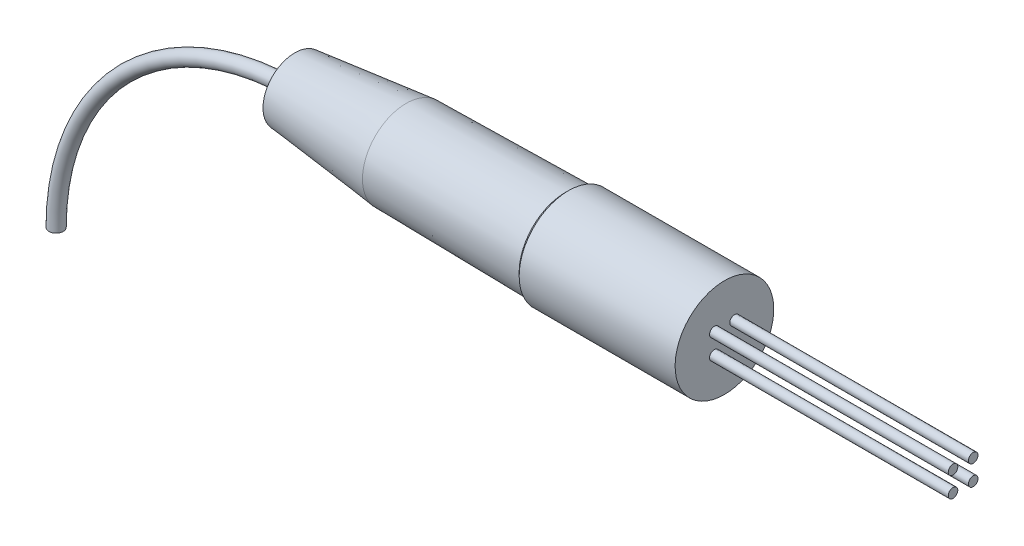
ISO-10303-21;
HEADER;
FILE_DESCRIPTION(('STEP AP214'),'2;1');
FILE_NAME('part.step','',(''),(''),'','','');
FILE_SCHEMA(('AUTOMOTIVE_DESIGN { 1 0 10303 214 1 1 1 1 }'));
ENDSEC;
DATA;
#1=APPLICATION_CONTEXT('core data for automotive mechanical design processes');
#2=APPLICATION_PROTOCOL_DEFINITION('international standard','automotive_design',2000,#1);
#3=PRODUCT_CONTEXT('',#1,'mechanical');
#4=PRODUCT('Part','Part','',(#3));
#5=PRODUCT_RELATED_PRODUCT_CATEGORY('part','',(#4));
#6=PRODUCT_DEFINITION_FORMATION('','',#4);
#7=PRODUCT_DEFINITION_CONTEXT('part definition',#1,'design');
#8=PRODUCT_DEFINITION('design','',#6,#7);
#9=PRODUCT_DEFINITION_SHAPE('','',#8);
#10=(LENGTH_UNIT() NAMED_UNIT(*) SI_UNIT(.MILLI.,.METRE.));
#11=(NAMED_UNIT(*) PLANE_ANGLE_UNIT() SI_UNIT($,.RADIAN.));
#12=(NAMED_UNIT(*) SI_UNIT($,.STERADIAN.) SOLID_ANGLE_UNIT());
#13=UNCERTAINTY_MEASURE_WITH_UNIT(LENGTH_MEASURE(1.E-05),#10,'distance_accuracy_value','');
#14=(GEOMETRIC_REPRESENTATION_CONTEXT(3) GLOBAL_UNCERTAINTY_ASSIGNED_CONTEXT((#13)) GLOBAL_UNIT_ASSIGNED_CONTEXT((#10,
#11,#12)) REPRESENTATION_CONTEXT('',''));
#15=CARTESIAN_POINT('',(0.,0.,0.));
#16=DIRECTION('',(0.,0.,1.));
#17=DIRECTION('',(1.,0.,0.));
#18=AXIS2_PLACEMENT_3D('',#15,#16,#17);
#19=CARTESIAN_POINT('',(0.,0.,0.));
#20=DIRECTION('',(-1.,0.,0.));
#21=DIRECTION('',(0.,-1.,0.));
#22=AXIS2_PLACEMENT_3D('',#19,#20,#21);
#23=PLANE('',#22);
#24=CARTESIAN_POINT('',(0.,0.635000000000003,-0.634999999999999));
#25=DIRECTION('',(-1.,0.,0.));
#26=DIRECTION('',(0.,-1.,0.));
#27=AXIS2_PLACEMENT_3D('',#24,#25,#26);
#28=CIRCLE('',#27,0.3);
#29=CARTESIAN_POINT('',(0.,0.335000000000003,-0.634999999999999));
#30=VERTEX_POINT('',#29);
#31=EDGE_CURVE('E36',#30,#30,#28,.F.);
#32=ORIENTED_EDGE('',*,*,#31,.F.);
#33=EDGE_LOOP('',(#32));
#34=FACE_BOUND('',#33,.T.);
#35=CARTESIAN_POINT('',(0.,0.635,0.634999999999999));
#36=DIRECTION('',(-1.,0.,0.));
#37=DIRECTION('',(0.,-1.,0.));
#38=AXIS2_PLACEMENT_3D('',#35,#36,#37);
#39=CIRCLE('',#38,0.3);
#40=CARTESIAN_POINT('',(0.,0.335,0.634999999999999));
#41=VERTEX_POINT('',#40);
#42=EDGE_CURVE('E44',#41,#41,#39,.F.);
#43=ORIENTED_EDGE('',*,*,#42,.F.);
#44=EDGE_LOOP('',(#43));
#45=FACE_BOUND('',#44,.T.);
#46=CARTESIAN_POINT('',(0.,0.,0.));
#47=DIRECTION('',(-1.,0.,0.));
#48=DIRECTION('',(0.,-1.,0.));
#49=AXIS2_PLACEMENT_3D('',#46,#47,#48);
#50=CIRCLE('',#49,3.1);
#51=CARTESIAN_POINT('',(0.,-3.1,0.));
#52=VERTEX_POINT('',#51);
#53=EDGE_CURVE('E62',#52,#52,#50,.T.);
#54=ORIENTED_EDGE('',*,*,#53,.F.);
#55=EDGE_LOOP('',(#54));
#56=FACE_BOUND('',#55,.T.);
#57=CARTESIAN_POINT('',(0.,-0.635,0.634999999999999));
#58=DIRECTION('',(-1.,0.,0.));
#59=DIRECTION('',(0.,-1.,0.));
#60=AXIS2_PLACEMENT_3D('',#57,#58,#59);
#61=CIRCLE('',#60,0.3);
#62=CARTESIAN_POINT('',(0.,-0.935,0.634999999999999));
#63=VERTEX_POINT('',#62);
#64=EDGE_CURVE('E40',#63,#63,#61,.F.);
#65=ORIENTED_EDGE('',*,*,#64,.F.);
#66=EDGE_LOOP('',(#65));
#67=FACE_BOUND('',#66,.T.);
#68=CARTESIAN_POINT('',(0.,-0.634999999999996,-0.634999999999999));
#69=DIRECTION('',(-1.,0.,0.));
#70=DIRECTION('',(0.,-1.,0.));
#71=AXIS2_PLACEMENT_3D('',#68,#69,#70);
#72=CIRCLE('',#71,0.3);
#73=CARTESIAN_POINT('',(0.,-0.934999999999996,-0.634999999999999));
#74=VERTEX_POINT('',#73);
#75=EDGE_CURVE('E10',#74,#74,#72,.F.);
#76=ORIENTED_EDGE('',*,*,#75,.F.);
#77=EDGE_LOOP('',(#76));
#78=FACE_BOUND('',#77,.T.);
#79=ADVANCED_FACE('F30',(#34,#45,#56,#67,#78),#23,.F.);
#80=CARTESIAN_POINT('',(-27.,1.99999999999999,0.));
#81=DIRECTION('',(1.,0.,0.));
#82=DIRECTION('',(0.,1.,0.));
#83=AXIS2_PLACEMENT_3D('',#80,#81,#82);
#84=PLANE('',#83);
#85=CARTESIAN_POINT('',(-27.,0.,0.));
#86=DIRECTION('',(-1.,0.,0.));
#87=DIRECTION('',(0.,-1.,0.));
#88=AXIS2_PLACEMENT_3D('',#85,#86,#87);
#89=CIRCLE('',#88,1.99999999999999);
#90=CARTESIAN_POINT('',(-27.,-1.99999999999999,0.));
#91=VERTEX_POINT('',#90);
#92=EDGE_CURVE('E53',#91,#91,#89,.T.);
#93=ORIENTED_EDGE('',*,*,#92,.T.);
#94=EDGE_LOOP('',(#93));
#95=FACE_BOUND('',#94,.T.);
#96=CARTESIAN_POINT('',(-27.,0.,0.));
#97=DIRECTION('',(-1.,0.,0.));
#98=DIRECTION('',(0.,-1.,0.));
#99=AXIS2_PLACEMENT_3D('',#96,#97,#98);
#100=CIRCLE('',#99,0.45);
#101=CARTESIAN_POINT('',(-27.,0.449999999999997,0.));
#102=VERTEX_POINT('',#101);
#103=EDGE_CURVE('E49',#102,#102,#100,.T.);
#104=ORIENTED_EDGE('',*,*,#103,.F.);
#105=EDGE_LOOP('',(#104));
#106=FACE_BOUND('',#105,.T.);
#107=ADVANCED_FACE('F98',(#95,#106),#84,.F.);
#108=CARTESIAN_POINT('',(-20.,0.,0.));
#109=DIRECTION('',(1.,0.,0.));
#110=DIRECTION('',(0.,1.,0.));
#111=AXIS2_PLACEMENT_3D('',#108,#109,#110);
#112=CONICAL_SURFACE('',#111,2.75,0.106735672649136);
#113=ORIENTED_EDGE('',*,*,#92,.F.);
#114=EDGE_LOOP('',(#113));
#115=FACE_BOUND('',#114,.T.);
#116=CARTESIAN_POINT('',(-20.,0.,0.));
#117=DIRECTION('',(-1.,0.,0.));
#118=DIRECTION('',(0.,-1.,0.));
#119=AXIS2_PLACEMENT_3D('',#116,#117,#118);
#120=CIRCLE('',#119,2.75);
#121=CARTESIAN_POINT('',(-20.,-2.75,0.));
#122=VERTEX_POINT('',#121);
#123=EDGE_CURVE('E56',#122,#122,#120,.T.);
#124=ORIENTED_EDGE('',*,*,#123,.T.);
#125=EDGE_LOOP('',(#124));
#126=FACE_BOUND('',#125,.T.);
#127=ADVANCED_FACE('F103',(#115,#126),#112,.T.);
#128=CARTESIAN_POINT('',(-10.,0.,0.));
#129=DIRECTION('',(1.,0.,0.));
#130=DIRECTION('',(0.,1.,0.));
#131=AXIS2_PLACEMENT_3D('',#128,#129,#130);
#132=CONICAL_SURFACE('',#131,2.9,0.0149988751518507);
#133=ORIENTED_EDGE('',*,*,#123,.F.);
#134=EDGE_LOOP('',(#133));
#135=FACE_BOUND('',#134,.T.);
#136=CARTESIAN_POINT('',(-10.,0.,0.));
#137=DIRECTION('',(-1.,0.,0.));
#138=DIRECTION('',(0.,-1.,0.));
#139=AXIS2_PLACEMENT_3D('',#136,#137,#138);
#140=CIRCLE('',#139,2.9);
#141=CARTESIAN_POINT('',(-10.,-2.9,0.));
#142=VERTEX_POINT('',#141);
#143=EDGE_CURVE('E59',#142,#142,#140,.T.);
#144=ORIENTED_EDGE('',*,*,#143,.T.);
#145=EDGE_LOOP('',(#144));
#146=FACE_BOUND('',#145,.T.);
#147=ADVANCED_FACE('F149',(#135,#146),#132,.T.);
#148=CARTESIAN_POINT('',(-27.,0.,0.));
#149=DIRECTION('',(-1.,0.,0.));
#150=DIRECTION('',(0.,-1.,0.));
#151=AXIS2_PLACEMENT_3D('',#148,#149,#150);
#152=CYLINDRICAL_SURFACE('',#151,3.1);
#153=CARTESIAN_POINT('',(-9.80000000000001,0.,0.));
#154=DIRECTION('',(1.,0.,0.));
#155=DIRECTION('',(0.,1.,0.));
#156=AXIS2_PLACEMENT_3D('',#153,#154,#155);
#157=CIRCLE('',#156,3.1);
#158=CARTESIAN_POINT('',(-9.80000000000001,3.1,0.));
#159=VERTEX_POINT('',#158);
#160=EDGE_CURVE('E50',#159,#159,#157,.T.);
#161=ORIENTED_EDGE('',*,*,#160,.T.);
#162=EDGE_LOOP('',(#161));
#163=FACE_BOUND('',#162,.T.);
#164=ORIENTED_EDGE('',*,*,#53,.T.);
#165=EDGE_LOOP('',(#164));
#166=FACE_BOUND('',#165,.T.);
#167=ADVANCED_FACE('F145',(#163,#166),#152,.T.);
#168=CARTESIAN_POINT('',(-10.,0.,0.));
#169=DIRECTION('',(1.,0.,0.));
#170=DIRECTION('',(0.,1.,0.));
#171=AXIS2_PLACEMENT_3D('',#168,#169,#170);
#172=CONICAL_SURFACE('',#171,2.9,0.785398163397456);
#173=ORIENTED_EDGE('',*,*,#160,.F.);
#174=EDGE_LOOP('',(#173));
#175=FACE_BOUND('',#174,.T.);
#176=ORIENTED_EDGE('',*,*,#143,.F.);
#177=EDGE_LOOP('',(#176));
#178=FACE_BOUND('',#177,.T.);
#179=ADVANCED_FACE('F139',(#175,#178),#172,.T.);
#180=CARTESIAN_POINT('',(-27.,-15.,0.));
#181=DIRECTION('',(0.,0.,-1.));
#182=DIRECTION('',(-1.,0.,0.));
#183=AXIS2_PLACEMENT_3D('',#180,#181,#182);
#184=TOROIDAL_SURFACE('',#183,15.,0.45);
#185=CARTESIAN_POINT('',(-42.,-15.,0.));
#186=DIRECTION('',(0.,-1.,0.));
#187=DIRECTION('',(1.,0.,0.));
#188=AXIS2_PLACEMENT_3D('',#185,#186,#187);
#189=CIRCLE('',#188,0.45);
#190=CARTESIAN_POINT('',(-42.45,-15.,0.));
#191=VERTEX_POINT('',#190);
#192=EDGE_CURVE('E65',#191,#191,#189,.T.);
#193=CARTESIAN_POINT('',(-27.,-15.,0.));
#194=DIRECTION('',(0.,0.,-1.));
#195=DIRECTION('',(-1.,0.,0.));
#196=AXIS2_PLACEMENT_3D('',#193,#194,#195);
#197=CIRCLE('',#196,15.45);
#198=EDGE_CURVE('',#191,#102,#197,.T.);
#199=ORIENTED_EDGE('',*,*,#192,.F.);
#200=ORIENTED_EDGE('',*,*,#103,.T.);
#201=ORIENTED_EDGE('',*,*,#198,.T.);
#202=ORIENTED_EDGE('',*,*,#198,.F.);
#203=EDGE_LOOP('',(#199,#201,#200,#202));
#204=FACE_BOUND('',#203,.T.);
#205=ADVANCED_FACE('F135',(#204),#184,.T.);
#206=CARTESIAN_POINT('',(-42.,-15.,0.));
#207=DIRECTION('',(0.,-1.,0.));
#208=DIRECTION('',(1.,0.,0.));
#209=AXIS2_PLACEMENT_3D('',#206,#207,#208);
#210=PLANE('',#209);
#211=ORIENTED_EDGE('',*,*,#192,.T.);
#212=EDGE_LOOP('',(#211));
#213=FACE_BOUND('',#212,.T.);
#214=ADVANCED_FACE('F133',(#213),#210,.T.);
#215=CARTESIAN_POINT('',(15.,0.635,0.634999999999999));
#216=DIRECTION('',(-1.,0.,0.));
#217=DIRECTION('',(0.,-1.,0.));
#218=AXIS2_PLACEMENT_3D('',#215,#216,#217);
#219=CYLINDRICAL_SURFACE('',#218,0.3);
#220=CARTESIAN_POINT('',(15.,0.635,0.634999999999999));
#221=DIRECTION('',(1.,0.,0.));
#222=DIRECTION('',(0.,1.,0.));
#223=AXIS2_PLACEMENT_3D('',#220,#221,#222);
#224=CIRCLE('',#223,0.3);
#225=CARTESIAN_POINT('',(15.,0.935,0.634999999999999));
#226=VERTEX_POINT('',#225);
#227=EDGE_CURVE('E68',#226,#226,#224,.T.);
#228=ORIENTED_EDGE('',*,*,#227,.F.);
#229=EDGE_LOOP('',(#228));
#230=FACE_BOUND('',#229,.T.);
#231=ORIENTED_EDGE('',*,*,#42,.T.);
#232=EDGE_LOOP('',(#231));
#233=FACE_BOUND('',#232,.T.);
#234=ADVANCED_FACE('F125',(#230,#233),#219,.T.);
#235=CARTESIAN_POINT('',(15.,0.635,0.634999999999999));
#236=DIRECTION('',(1.,0.,0.));
#237=DIRECTION('',(0.,1.,0.));
#238=AXIS2_PLACEMENT_3D('',#235,#236,#237);
#239=PLANE('',#238);
#240=ORIENTED_EDGE('',*,*,#227,.T.);
#241=EDGE_LOOP('',(#240));
#242=FACE_BOUND('',#241,.T.);
#243=ADVANCED_FACE('F116',(#242),#239,.T.);
#244=CARTESIAN_POINT('',(15.,-0.635,0.634999999999999));
#245=DIRECTION('',(-1.,0.,0.));
#246=DIRECTION('',(0.,-1.,0.));
#247=AXIS2_PLACEMENT_3D('',#244,#245,#246);
#248=CYLINDRICAL_SURFACE('',#247,0.3);
#249=CARTESIAN_POINT('',(15.,-0.635,0.634999999999999));
#250=DIRECTION('',(1.,0.,0.));
#251=DIRECTION('',(0.,-1.,0.));
#252=AXIS2_PLACEMENT_3D('',#249,#250,#251);
#253=CIRCLE('',#252,0.3);
#254=CARTESIAN_POINT('',(15.,-0.935,0.634999999999999));
#255=VERTEX_POINT('',#254);
#256=EDGE_CURVE('E73',#255,#255,#253,.T.);
#257=ORIENTED_EDGE('',*,*,#256,.F.);
#258=EDGE_LOOP('',(#257));
#259=FACE_BOUND('',#258,.T.);
#260=ORIENTED_EDGE('',*,*,#64,.T.);
#261=EDGE_LOOP('',(#260));
#262=FACE_BOUND('',#261,.T.);
#263=ADVANCED_FACE('F113',(#259,#262),#248,.T.);
#264=CARTESIAN_POINT('',(15.,-0.635,0.634999999999999));
#265=DIRECTION('',(-1.,0.,0.));
#266=DIRECTION('',(0.,-1.,0.));
#267=AXIS2_PLACEMENT_3D('',#264,#265,#266);
#268=PLANE('',#267);
#269=ORIENTED_EDGE('',*,*,#256,.T.);
#270=EDGE_LOOP('',(#269));
#271=FACE_BOUND('',#270,.T.);
#272=ADVANCED_FACE('F115',(#271),#268,.F.);
#273=CARTESIAN_POINT('',(15.,0.635000000000003,-0.634999999999999));
#274=DIRECTION('',(-1.,0.,0.));
#275=DIRECTION('',(0.,-1.,0.));
#276=AXIS2_PLACEMENT_3D('',#273,#274,#275);
#277=CYLINDRICAL_SURFACE('',#276,0.3);
#278=CARTESIAN_POINT('',(15.,0.635000000000003,-0.634999999999999));
#279=DIRECTION('',(1.,0.,0.));
#280=DIRECTION('',(0.,-1.,0.));
#281=AXIS2_PLACEMENT_3D('',#278,#279,#280);
#282=CIRCLE('',#281,0.3);
#283=CARTESIAN_POINT('',(15.,0.335000000000003,-0.634999999999999));
#284=VERTEX_POINT('',#283);
#285=EDGE_CURVE('E76',#284,#284,#282,.T.);
#286=ORIENTED_EDGE('',*,*,#285,.F.);
#287=EDGE_LOOP('',(#286));
#288=FACE_BOUND('',#287,.T.);
#289=ORIENTED_EDGE('',*,*,#31,.T.);
#290=EDGE_LOOP('',(#289));
#291=FACE_BOUND('',#290,.T.);
#292=ADVANCED_FACE('F94',(#288,#291),#277,.T.);
#293=CARTESIAN_POINT('',(15.,0.635000000000003,-0.634999999999999));
#294=DIRECTION('',(-1.,0.,0.));
#295=DIRECTION('',(0.,-1.,0.));
#296=AXIS2_PLACEMENT_3D('',#293,#294,#295);
#297=PLANE('',#296);
#298=ORIENTED_EDGE('',*,*,#285,.T.);
#299=EDGE_LOOP('',(#298));
#300=FACE_BOUND('',#299,.T.);
#301=ADVANCED_FACE('F87',(#300),#297,.F.);
#302=CARTESIAN_POINT('',(15.,-0.634999999999997,-0.634999999999999));
#303=DIRECTION('',(-1.,0.,0.));
#304=DIRECTION('',(0.,-1.,0.));
#305=AXIS2_PLACEMENT_3D('',#302,#303,#304);
#306=CYLINDRICAL_SURFACE('',#305,0.3);
#307=CARTESIAN_POINT('',(15.,-0.634999999999997,-0.634999999999999));
#308=DIRECTION('',(1.,0.,0.));
#309=DIRECTION('',(0.,1.,0.));
#310=AXIS2_PLACEMENT_3D('',#307,#308,#309);
#311=CIRCLE('',#310,0.3);
#312=CARTESIAN_POINT('',(15.,-0.334999999999997,-0.634999999999999));
#313=VERTEX_POINT('',#312);
#314=EDGE_CURVE('E79',#313,#313,#311,.T.);
#315=ORIENTED_EDGE('',*,*,#314,.F.);
#316=EDGE_LOOP('',(#315));
#317=FACE_BOUND('',#316,.T.);
#318=ORIENTED_EDGE('',*,*,#75,.T.);
#319=EDGE_LOOP('',(#318));
#320=FACE_BOUND('',#319,.T.);
#321=ADVANCED_FACE('F85',(#317,#320),#306,.T.);
#322=CARTESIAN_POINT('',(15.,-0.634999999999997,-0.634999999999999));
#323=DIRECTION('',(1.,0.,0.));
#324=DIRECTION('',(0.,1.,0.));
#325=AXIS2_PLACEMENT_3D('',#322,#323,#324);
#326=PLANE('',#325);
#327=ORIENTED_EDGE('',*,*,#314,.T.);
#328=EDGE_LOOP('',(#327));
#329=FACE_BOUND('',#328,.T.);
#330=ADVANCED_FACE('F83',(#329),#326,.T.);
#331=CLOSED_SHELL('',(#79,#107,#127,#147,#167,#179,#205,#214,#234,#243,#263,#272,#292,#301,#321,#330));
#332=MANIFOLD_SOLID_BREP('B2',#331);
#333=ADVANCED_BREP_SHAPE_REPRESENTATION('',(#18,#332),#14);
#334=SHAPE_DEFINITION_REPRESENTATION(#9,#333);
ENDSEC;
END-ISO-10303-21;
